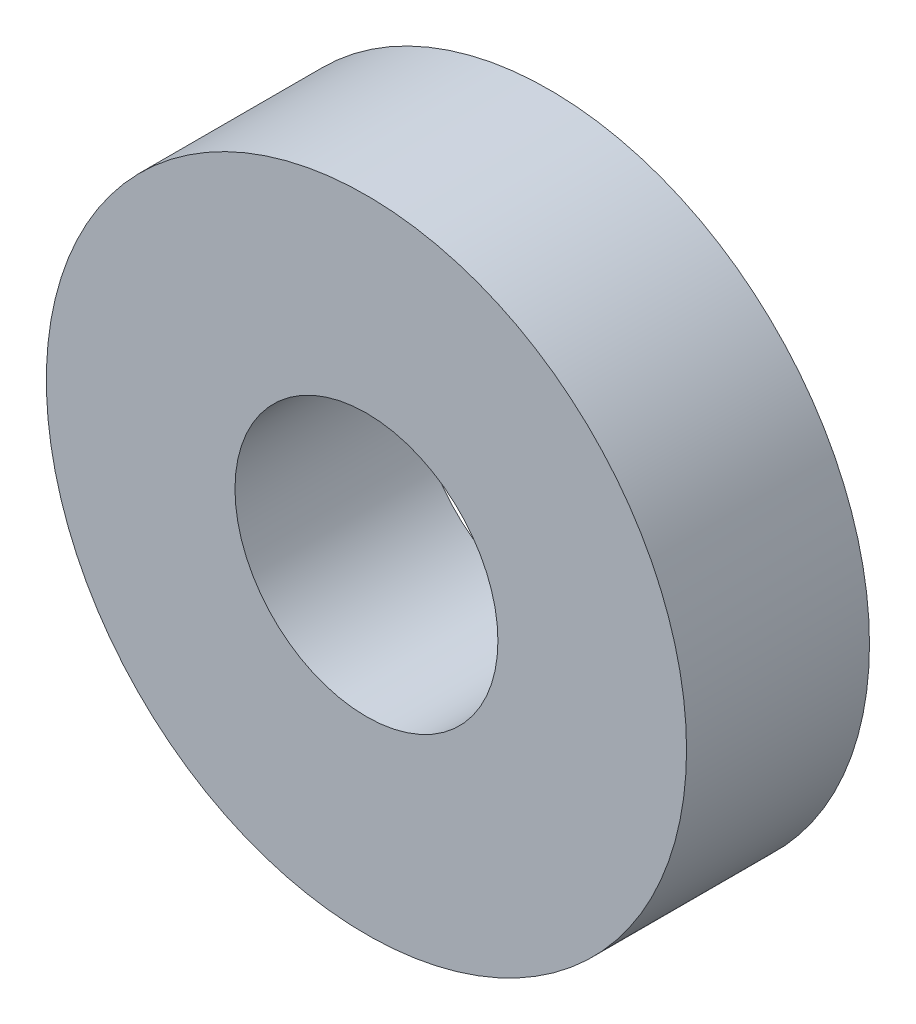
ISO-10303-21;
HEADER;
FILE_DESCRIPTION(('STEP AP214'),'2;1');
FILE_NAME('part.step','',(''),(''),'','','');
FILE_SCHEMA(('AUTOMOTIVE_DESIGN { 1 0 10303 214 1 1 1 1 }'));
ENDSEC;
DATA;
#1=APPLICATION_CONTEXT('core data for automotive mechanical design processes');
#2=APPLICATION_PROTOCOL_DEFINITION('international standard','automotive_design',2000,#1);
#3=PRODUCT_CONTEXT('',#1,'mechanical');
#4=PRODUCT('Part','Part','',(#3));
#5=PRODUCT_RELATED_PRODUCT_CATEGORY('part','',(#4));
#6=PRODUCT_DEFINITION_FORMATION('','',#4);
#7=PRODUCT_DEFINITION_CONTEXT('part definition',#1,'design');
#8=PRODUCT_DEFINITION('design','',#6,#7);
#9=PRODUCT_DEFINITION_SHAPE('','',#8);
#10=(LENGTH_UNIT() NAMED_UNIT(*) SI_UNIT(.MILLI.,.METRE.));
#11=(NAMED_UNIT(*) PLANE_ANGLE_UNIT() SI_UNIT($,.RADIAN.));
#12=(NAMED_UNIT(*) SI_UNIT($,.STERADIAN.) SOLID_ANGLE_UNIT());
#13=UNCERTAINTY_MEASURE_WITH_UNIT(LENGTH_MEASURE(1.E-05),#10,'distance_accuracy_value','');
#14=(GEOMETRIC_REPRESENTATION_CONTEXT(3) GLOBAL_UNCERTAINTY_ASSIGNED_CONTEXT((#13)) GLOBAL_UNIT_ASSIGNED_CONTEXT((#10,
#11,#12)) REPRESENTATION_CONTEXT('',''));
#15=CARTESIAN_POINT('',(0.,0.,0.));
#16=DIRECTION('',(0.,0.,1.));
#17=DIRECTION('',(1.,0.,0.));
#18=AXIS2_PLACEMENT_3D('',#15,#16,#17);
#19=CARTESIAN_POINT('',(0.,0.,8.));
#20=DIRECTION('',(0.,0.,1.));
#21=DIRECTION('',(1.,0.,0.));
#22=AXIS2_PLACEMENT_3D('',#19,#20,#21);
#23=PLANE('',#22);
#24=CARTESIAN_POINT('',(0.,0.,8.));
#25=DIRECTION('',(0.,0.,1.));
#26=DIRECTION('',(1.,0.,0.));
#27=AXIS2_PLACEMENT_3D('',#24,#25,#26);
#28=CIRCLE('',#27,14.);
#29=CARTESIAN_POINT('',(14.,0.,8.));
#30=VERTEX_POINT('',#29);
#31=EDGE_CURVE('E10',#30,#30,#28,.T.);
#32=ORIENTED_EDGE('',*,*,#31,.T.);
#33=EDGE_LOOP('',(#32));
#34=FACE_BOUND('',#33,.T.);
#35=CARTESIAN_POINT('',(0.,0.,8.));
#36=DIRECTION('',(0.,0.,1.));
#37=DIRECTION('',(1.,0.,0.));
#38=AXIS2_PLACEMENT_3D('',#35,#36,#37);
#39=CIRCLE('',#38,5.75);
#40=CARTESIAN_POINT('',(5.75,0.,8.));
#41=VERTEX_POINT('',#40);
#42=EDGE_CURVE('E46',#41,#41,#39,.T.);
#43=ORIENTED_EDGE('',*,*,#42,.F.);
#44=EDGE_LOOP('',(#43));
#45=FACE_BOUND('',#44,.T.);
#46=ADVANCED_FACE('F32',(#34,#45),#23,.T.);
#47=CARTESIAN_POINT('',(0.,0.,0.));
#48=DIRECTION('',(0.,0.,1.));
#49=DIRECTION('',(1.,0.,0.));
#50=AXIS2_PLACEMENT_3D('',#47,#48,#49);
#51=PLANE('',#50);
#52=CARTESIAN_POINT('',(0.,0.,0.));
#53=DIRECTION('',(0.,0.,1.));
#54=DIRECTION('',(1.,0.,0.));
#55=AXIS2_PLACEMENT_3D('',#52,#53,#54);
#56=CIRCLE('',#55,14.);
#57=CARTESIAN_POINT('',(14.,0.,0.));
#58=VERTEX_POINT('',#57);
#59=EDGE_CURVE('E36',#58,#58,#56,.T.);
#60=ORIENTED_EDGE('',*,*,#59,.F.);
#61=EDGE_LOOP('',(#60));
#62=FACE_BOUND('',#61,.T.);
#63=CARTESIAN_POINT('',(0.,0.,0.));
#64=DIRECTION('',(0.,0.,1.));
#65=DIRECTION('',(1.,0.,0.));
#66=AXIS2_PLACEMENT_3D('',#63,#64,#65);
#67=CIRCLE('',#66,5.75);
#68=CARTESIAN_POINT('',(5.75,0.,0.));
#69=VERTEX_POINT('',#68);
#70=EDGE_CURVE('E48',#69,#69,#67,.T.);
#71=ORIENTED_EDGE('',*,*,#70,.T.);
#72=EDGE_LOOP('',(#71));
#73=FACE_BOUND('',#72,.T.);
#74=ADVANCED_FACE('F59',(#62,#73),#51,.F.);
#75=CARTESIAN_POINT('',(0.,0.,8.));
#76=DIRECTION('',(0.,0.,-1.));
#77=DIRECTION('',(-1.,0.,0.));
#78=AXIS2_PLACEMENT_3D('',#75,#76,#77);
#79=CYLINDRICAL_SURFACE('',#78,14.);
#80=ORIENTED_EDGE('',*,*,#31,.F.);
#81=EDGE_LOOP('',(#80));
#82=FACE_BOUND('',#81,.T.);
#83=ORIENTED_EDGE('',*,*,#59,.T.);
#84=EDGE_LOOP('',(#83));
#85=FACE_BOUND('',#84,.T.);
#86=ADVANCED_FACE('F34',(#82,#85),#79,.T.);
#87=CARTESIAN_POINT('',(0.,0.,8.));
#88=DIRECTION('',(0.,0.,-1.));
#89=DIRECTION('',(-1.,0.,0.));
#90=AXIS2_PLACEMENT_3D('',#87,#88,#89);
#91=CYLINDRICAL_SURFACE('',#90,5.75);
#92=ORIENTED_EDGE('',*,*,#42,.T.);
#93=EDGE_LOOP('',(#92));
#94=FACE_BOUND('',#93,.T.);
#95=ORIENTED_EDGE('',*,*,#70,.F.);
#96=EDGE_LOOP('',(#95));
#97=FACE_BOUND('',#96,.T.);
#98=ADVANCED_FACE('F55',(#94,#97),#91,.F.);
#99=CLOSED_SHELL('',(#46,#74,#86,#98));
#100=MANIFOLD_SOLID_BREP('B2',#99);
#101=ADVANCED_BREP_SHAPE_REPRESENTATION('',(#18,#100),#14);
#102=SHAPE_DEFINITION_REPRESENTATION(#9,#101);
ENDSEC;
END-ISO-10303-21;
